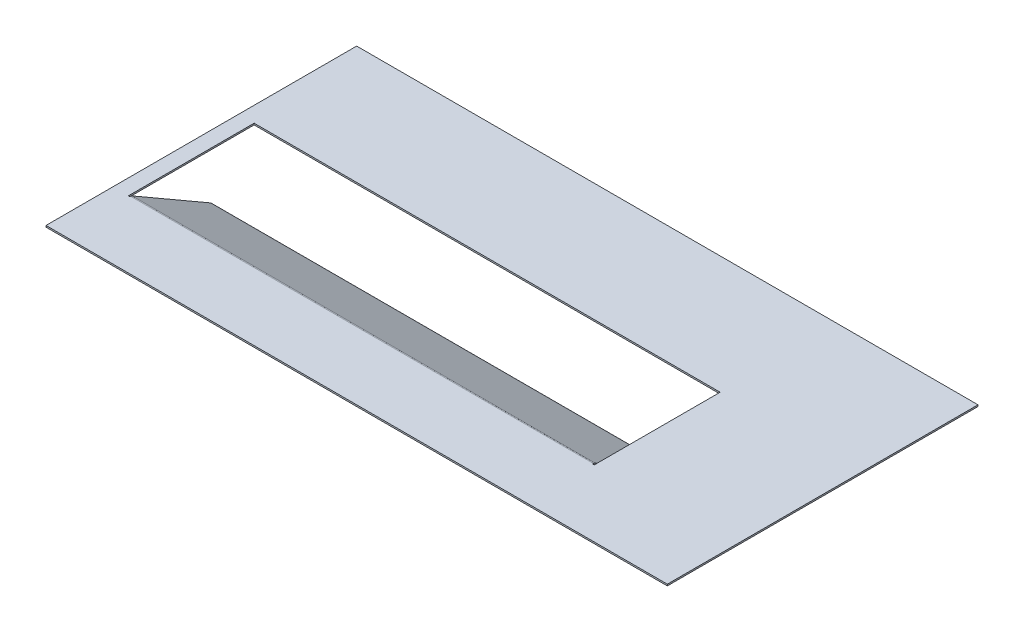
ISO-10303-21;
HEADER;
FILE_DESCRIPTION(('STEP AP214'),'2;1');
FILE_NAME('part.step','',(''),(''),'','','');
FILE_SCHEMA(('AUTOMOTIVE_DESIGN { 1 0 10303 214 1 1 1 1 }'));
ENDSEC;
DATA;
#1=APPLICATION_CONTEXT('core data for automotive mechanical design processes');
#2=APPLICATION_PROTOCOL_DEFINITION('international standard','automotive_design',2000,#1);
#3=PRODUCT_CONTEXT('',#1,'mechanical');
#4=PRODUCT('Part','Part','',(#3));
#5=PRODUCT_RELATED_PRODUCT_CATEGORY('part','',(#4));
#6=PRODUCT_DEFINITION_FORMATION('','',#4);
#7=PRODUCT_DEFINITION_CONTEXT('part definition',#1,'design');
#8=PRODUCT_DEFINITION('design','',#6,#7);
#9=PRODUCT_DEFINITION_SHAPE('','',#8);
#10=(LENGTH_UNIT() NAMED_UNIT(*) SI_UNIT(.MILLI.,.METRE.));
#11=(NAMED_UNIT(*) PLANE_ANGLE_UNIT() SI_UNIT($,.RADIAN.));
#12=(NAMED_UNIT(*) SI_UNIT($,.STERADIAN.) SOLID_ANGLE_UNIT());
#13=UNCERTAINTY_MEASURE_WITH_UNIT(LENGTH_MEASURE(1.E-05),#10,'distance_accuracy_value','');
#14=(GEOMETRIC_REPRESENTATION_CONTEXT(3) GLOBAL_UNCERTAINTY_ASSIGNED_CONTEXT((#13)) GLOBAL_UNIT_ASSIGNED_CONTEXT((#10,
#11,#12)) REPRESENTATION_CONTEXT('',''));
#15=CARTESIAN_POINT('',(0.,0.,0.));
#16=DIRECTION('',(0.,0.,1.));
#17=DIRECTION('',(1.,0.,0.));
#18=AXIS2_PLACEMENT_3D('',#15,#16,#17);
#19=CARTESIAN_POINT('',(-1000.,0.,0.));
#20=DIRECTION('',(0.,0.,-1.));
#21=DIRECTION('',(-1.,0.,0.));
#22=AXIS2_PLACEMENT_3D('',#19,#20,#21);
#23=PLANE('',#22);
#24=DIRECTION('',(1.,0.,0.));
#25=VECTOR('',#24,1.);
#26=CARTESIAN_POINT('',(0.,2.5,0.));
#27=LINE('',#26,#25);
#28=CARTESIAN_POINT('',(-1000.,2.5,0.));
#29=VERTEX_POINT('',#28);
#30=CARTESIAN_POINT('',(0.,2.5,0.));
#31=VERTEX_POINT('',#30);
#32=EDGE_CURVE('E293',#29,#31,#27,.T.);
#33=ORIENTED_EDGE('',*,*,#32,.T.);
#34=DIRECTION('',(0.,1.,0.));
#35=VECTOR('',#34,1.);
#36=CARTESIAN_POINT('',(0.,0.,0.));
#37=LINE('',#36,#35);
#38=CARTESIAN_POINT('',(0.,0.,0.));
#39=VERTEX_POINT('',#38);
#40=EDGE_CURVE('E238',#39,#31,#37,.T.);
#41=ORIENTED_EDGE('',*,*,#40,.F.);
#42=DIRECTION('',(-1.,0.,0.));
#43=VECTOR('',#42,1.);
#44=CARTESIAN_POINT('',(0.,0.,0.));
#45=LINE('',#44,#43);
#46=CARTESIAN_POINT('',(-1000.,0.,0.));
#47=VERTEX_POINT('',#46);
#48=EDGE_CURVE('E368',#39,#47,#45,.T.);
#49=ORIENTED_EDGE('',*,*,#48,.T.);
#50=DIRECTION('',(0.,1.,0.));
#51=VECTOR('',#50,1.);
#52=CARTESIAN_POINT('',(-1000.,0.,0.));
#53=LINE('',#52,#51);
#54=EDGE_CURVE('E11',#47,#29,#53,.T.);
#55=ORIENTED_EDGE('',*,*,#54,.T.);
#56=EDGE_LOOP('',(#33,#41,#49,#55));
#57=FACE_BOUND('',#56,.T.);
#58=ADVANCED_FACE('F17',(#57),#23,.T.);
#59=CARTESIAN_POINT('',(-1000.,0.,500.));
#60=DIRECTION('',(-1.,0.,0.));
#61=DIRECTION('',(0.,0.,1.));
#62=AXIS2_PLACEMENT_3D('',#59,#60,#61);
#63=PLANE('',#62);
#64=DIRECTION('',(0.,0.,-1.));
#65=VECTOR('',#64,1.);
#66=CARTESIAN_POINT('',(-1000.,2.5,0.));
#67=LINE('',#66,#65);
#68=CARTESIAN_POINT('',(-1000.,2.5,500.));
#69=VERTEX_POINT('',#68);
#70=EDGE_CURVE('E289',#69,#29,#67,.T.);
#71=ORIENTED_EDGE('',*,*,#70,.T.);
#72=ORIENTED_EDGE('',*,*,#54,.F.);
#73=DIRECTION('',(0.,0.,1.));
#74=VECTOR('',#73,1.);
#75=CARTESIAN_POINT('',(-1000.,0.,0.));
#76=LINE('',#75,#74);
#77=CARTESIAN_POINT('',(-1000.,0.,500.));
#78=VERTEX_POINT('',#77);
#79=EDGE_CURVE('E241',#47,#78,#76,.T.);
#80=ORIENTED_EDGE('',*,*,#79,.T.);
#81=DIRECTION('',(0.,1.,0.));
#82=VECTOR('',#81,1.);
#83=CARTESIAN_POINT('',(-1000.,0.,500.));
#84=LINE('',#83,#82);
#85=EDGE_CURVE('E28',#78,#69,#84,.T.);
#86=ORIENTED_EDGE('',*,*,#85,.T.);
#87=EDGE_LOOP('',(#71,#72,#80,#86));
#88=FACE_BOUND('',#87,.T.);
#89=ADVANCED_FACE('F688',(#88),#63,.T.);
#90=CARTESIAN_POINT('',(1.71574348007947E-13,0.,500.));
#91=DIRECTION('',(0.,0.,1.));
#92=DIRECTION('',(1.,0.,0.));
#93=AXIS2_PLACEMENT_3D('',#90,#91,#92);
#94=PLANE('',#93);
#95=DIRECTION('',(-1.,0.,0.));
#96=VECTOR('',#95,1.);
#97=CARTESIAN_POINT('',(-1000.,2.5,500.));
#98=LINE('',#97,#96);
#99=CARTESIAN_POINT('',(1.71574348007947E-13,2.5,500.));
#100=VERTEX_POINT('',#99);
#101=EDGE_CURVE('E292',#100,#69,#98,.T.);
#102=ORIENTED_EDGE('',*,*,#101,.T.);
#103=ORIENTED_EDGE('',*,*,#85,.F.);
#104=DIRECTION('',(1.,0.,0.));
#105=VECTOR('',#104,1.);
#106=CARTESIAN_POINT('',(-1000.,0.,500.));
#107=LINE('',#106,#105);
#108=CARTESIAN_POINT('',(1.71574348007947E-13,0.,500.));
#109=VERTEX_POINT('',#108);
#110=EDGE_CURVE('E246',#78,#109,#107,.T.);
#111=ORIENTED_EDGE('',*,*,#110,.T.);
#112=DIRECTION('',(0.,1.,0.));
#113=VECTOR('',#112,1.);
#114=CARTESIAN_POINT('',(1.71574348007947E-13,0.,500.));
#115=LINE('',#114,#113);
#116=EDGE_CURVE('E236',#109,#100,#115,.T.);
#117=ORIENTED_EDGE('',*,*,#116,.T.);
#118=EDGE_LOOP('',(#102,#103,#111,#117));
#119=FACE_BOUND('',#118,.T.);
#120=ADVANCED_FACE('F690',(#119),#94,.T.);
#121=CARTESIAN_POINT('',(0.,0.,0.));
#122=DIRECTION('',(1.,0.,0.));
#123=DIRECTION('',(0.,0.,-1.));
#124=AXIS2_PLACEMENT_3D('',#121,#122,#123);
#125=PLANE('',#124);
#126=DIRECTION('',(0.,0.,1.));
#127=VECTOR('',#126,1.);
#128=CARTESIAN_POINT('',(1.71574348007947E-13,2.5,500.));
#129=LINE('',#128,#127);
#130=EDGE_CURVE('E212',#31,#100,#129,.T.);
#131=ORIENTED_EDGE('',*,*,#130,.T.);
#132=ORIENTED_EDGE('',*,*,#116,.F.);
#133=DIRECTION('',(0.,0.,-1.));
#134=VECTOR('',#133,1.);
#135=CARTESIAN_POINT('',(1.71574348007947E-13,0.,500.));
#136=LINE('',#135,#134);
#137=EDGE_CURVE('E372',#109,#39,#136,.T.);
#138=ORIENTED_EDGE('',*,*,#137,.T.);
#139=ORIENTED_EDGE('',*,*,#40,.T.);
#140=EDGE_LOOP('',(#131,#132,#138,#139));
#141=FACE_BOUND('',#140,.T.);
#142=ADVANCED_FACE('F683',(#141),#125,.T.);
#143=CARTESIAN_POINT('',(-975.,2.5,390.));
#144=DIRECTION('',(-1.,0.,0.));
#145=DIRECTION('',(0.,0.,1.));
#146=AXIS2_PLACEMENT_3D('',#143,#144,#145);
#147=PLANE('',#146);
#148=DIRECTION('',(0.,0.,1.));
#149=VECTOR('',#148,1.);
#150=CARTESIAN_POINT('',(-975.,0.,320.));
#151=LINE('',#150,#149);
#152=CARTESIAN_POINT('',(-975.,0.,190.));
#153=VERTEX_POINT('',#152);
#154=CARTESIAN_POINT('',(-975.,0.,392.589745962156));
#155=VERTEX_POINT('',#154);
#156=EDGE_CURVE('E355',#153,#155,#151,.T.);
#157=ORIENTED_EDGE('',*,*,#156,.F.);
#158=DIRECTION('',(0.,-1.,0.));
#159=VECTOR('',#158,1.);
#160=CARTESIAN_POINT('',(-975.,2.5,190.));
#161=LINE('',#160,#159);
#162=CARTESIAN_POINT('',(-975.,2.5,190.));
#163=VERTEX_POINT('',#162);
#164=EDGE_CURVE('E42',#163,#153,#161,.T.);
#165=ORIENTED_EDGE('',*,*,#164,.F.);
#166=DIRECTION('',(0.,0.,-1.));
#167=VECTOR('',#166,1.);
#168=CARTESIAN_POINT('',(-975.,2.5,320.));
#169=LINE('',#168,#167);
#170=CARTESIAN_POINT('',(-975.,2.5,392.589745962156));
#171=VERTEX_POINT('',#170);
#172=EDGE_CURVE('E322',#171,#163,#169,.T.);
#173=ORIENTED_EDGE('',*,*,#172,.F.);
#174=DIRECTION('',(0.,1.,0.));
#175=VECTOR('',#174,1.);
#176=CARTESIAN_POINT('',(-975.,0.,392.589745962156));
#177=LINE('',#176,#175);
#178=EDGE_CURVE('E373',#155,#171,#177,.T.);
#179=ORIENTED_EDGE('',*,*,#178,.F.);
#180=EDGE_LOOP('',(#157,#165,#173,#179));
#181=FACE_BOUND('',#180,.T.);
#182=ADVANCED_FACE('F657',(#181),#147,.F.);
#183=CARTESIAN_POINT('',(-429.951279615458,2.5,190.));
#184=DIRECTION('',(0.,0.,-1.));
#185=DIRECTION('',(0.,-1.,0.));
#186=AXIS2_PLACEMENT_3D('',#183,#184,#185);
#187=PLANE('',#186);
#188=DIRECTION('',(-1.,0.,0.));
#189=VECTOR('',#188,1.);
#190=CARTESIAN_POINT('',(-464.975639807729,0.,190.));
#191=LINE('',#190,#189);
#192=CARTESIAN_POINT('',(-225.,0.,190.));
#193=VERTEX_POINT('',#192);
#194=EDGE_CURVE('E351',#193,#153,#191,.T.);
#195=ORIENTED_EDGE('',*,*,#194,.F.);
#196=DIRECTION('',(0.,-1.,0.));
#197=VECTOR('',#196,1.);
#198=CARTESIAN_POINT('',(-225.,2.5,190.));
#199=LINE('',#198,#197);
#200=CARTESIAN_POINT('',(-225.,2.5,190.));
#201=VERTEX_POINT('',#200);
#202=EDGE_CURVE('E391',#201,#193,#199,.T.);
#203=ORIENTED_EDGE('',*,*,#202,.F.);
#204=DIRECTION('',(1.,0.,0.));
#205=VECTOR('',#204,1.);
#206=CARTESIAN_POINT('',(-464.975639807729,2.5,190.));
#207=LINE('',#206,#205);
#208=EDGE_CURVE('E21',#163,#201,#207,.T.);
#209=ORIENTED_EDGE('',*,*,#208,.F.);
#210=ORIENTED_EDGE('',*,*,#164,.T.);
#211=EDGE_LOOP('',(#195,#203,#209,#210));
#212=FACE_BOUND('',#211,.T.);
#213=ADVANCED_FACE('F651',(#212),#187,.F.);
#214=CARTESIAN_POINT('',(-225.,2.5,190.));
#215=DIRECTION('',(1.,0.,0.));
#216=DIRECTION('',(0.,0.,-1.));
#217=AXIS2_PLACEMENT_3D('',#214,#215,#216);
#218=PLANE('',#217);
#219=DIRECTION('',(0.,0.,-1.));
#220=VECTOR('',#219,1.);
#221=CARTESIAN_POINT('',(-225.,0.,320.));
#222=LINE('',#221,#220);
#223=CARTESIAN_POINT('',(-225.,0.,392.589745962156));
#224=VERTEX_POINT('',#223);
#225=EDGE_CURVE('E245',#224,#193,#222,.T.);
#226=ORIENTED_EDGE('',*,*,#225,.F.);
#227=DIRECTION('',(0.,1.,0.));
#228=VECTOR('',#227,1.);
#229=CARTESIAN_POINT('',(-225.,0.,392.589745962156));
#230=LINE('',#229,#228);
#231=CARTESIAN_POINT('',(-225.,2.5,392.589745962156));
#232=VERTEX_POINT('',#231);
#233=EDGE_CURVE('E208',#224,#232,#230,.T.);
#234=ORIENTED_EDGE('',*,*,#233,.T.);
#235=DIRECTION('',(0.,0.,1.));
#236=VECTOR('',#235,1.);
#237=CARTESIAN_POINT('',(-225.,2.5,320.));
#238=LINE('',#237,#236);
#239=EDGE_CURVE('E303',#201,#232,#238,.T.);
#240=ORIENTED_EDGE('',*,*,#239,.F.);
#241=ORIENTED_EDGE('',*,*,#202,.T.);
#242=EDGE_LOOP('',(#226,#234,#240,#241));
#243=FACE_BOUND('',#242,.T.);
#244=ADVANCED_FACE('F649',(#243),#218,.F.);
#245=CARTESIAN_POINT('',(-500.,0.,250.));
#246=DIRECTION('',(0.,1.,0.));
#247=DIRECTION('',(1.,0.,0.));
#248=AXIS2_PLACEMENT_3D('',#245,#246,#247);
#249=PLANE('',#248);
#250=ORIENTED_EDGE('',*,*,#225,.T.);
#251=ORIENTED_EDGE('',*,*,#194,.T.);
#252=ORIENTED_EDGE('',*,*,#156,.T.);
#253=DIRECTION('',(1.,0.,0.));
#254=VECTOR('',#253,1.);
#255=CARTESIAN_POINT('',(-736.25,0.,392.589745962156));
#256=LINE('',#255,#254);
#257=CARTESIAN_POINT('',(-972.5,0.,392.589745962156));
#258=VERTEX_POINT('',#257);
#259=EDGE_CURVE('E397',#155,#258,#256,.T.);
#260=ORIENTED_EDGE('',*,*,#259,.T.);
#261=DIRECTION('',(0.,0.,-1.));
#262=VECTOR('',#261,1.);
#263=CARTESIAN_POINT('',(-972.5,0.,320.));
#264=LINE('',#263,#262);
#265=CARTESIAN_POINT('',(-972.5,0.,391.339745962156));
#266=VERTEX_POINT('',#265);
#267=EDGE_CURVE('E333',#258,#266,#264,.T.);
#268=ORIENTED_EDGE('',*,*,#267,.T.);
#269=DIRECTION('',(1.,0.,0.));
#270=VECTOR('',#269,1.);
#271=CARTESIAN_POINT('',(-363.75,0.,391.339745962156));
#272=LINE('',#271,#270);
#273=CARTESIAN_POINT('',(-227.5,0.,391.339745962156));
#274=VERTEX_POINT('',#273);
#275=EDGE_CURVE('E219',#266,#274,#272,.T.);
#276=ORIENTED_EDGE('',*,*,#275,.T.);
#277=DIRECTION('',(0.,0.,1.));
#278=VECTOR('',#277,1.);
#279=CARTESIAN_POINT('',(-227.5,0.,321.294872981078));
#280=LINE('',#279,#278);
#281=CARTESIAN_POINT('',(-227.5,0.,392.589745962156));
#282=VERTEX_POINT('',#281);
#283=EDGE_CURVE('E215',#274,#282,#280,.T.);
#284=ORIENTED_EDGE('',*,*,#283,.T.);
#285=DIRECTION('',(1.,0.,0.));
#286=VECTOR('',#285,1.);
#287=CARTESIAN_POINT('',(-362.5,0.,392.589745962156));
#288=LINE('',#287,#286);
#289=EDGE_CURVE('E201',#282,#224,#288,.T.);
#290=ORIENTED_EDGE('',*,*,#289,.T.);
#291=EDGE_LOOP('',(#250,#251,#252,#260,#268,#276,#284,#290));
#292=FACE_BOUND('',#291,.T.);
#293=ORIENTED_EDGE('',*,*,#48,.F.);
#294=ORIENTED_EDGE('',*,*,#137,.F.);
#295=ORIENTED_EDGE('',*,*,#110,.F.);
#296=ORIENTED_EDGE('',*,*,#79,.F.);
#297=EDGE_LOOP('',(#293,#294,#295,#296));
#298=FACE_BOUND('',#297,.T.);
#299=ADVANCED_FACE('F216',(#292,#298),#249,.F.);
#300=CARTESIAN_POINT('',(-972.5,0.,392.589745962156));
#301=DIRECTION('',(0.,0.,1.));
#302=DIRECTION('',(1.,0.,0.));
#303=AXIS2_PLACEMENT_3D('',#300,#301,#302);
#304=PLANE('',#303);
#305=DIRECTION('',(-1.,0.,0.));
#306=VECTOR('',#305,1.);
#307=CARTESIAN_POINT('',(-736.25,2.5,392.589745962156));
#308=LINE('',#307,#306);
#309=CARTESIAN_POINT('',(-972.5,2.5,392.589745962156));
#310=VERTEX_POINT('',#309);
#311=EDGE_CURVE('E318',#310,#171,#308,.T.);
#312=ORIENTED_EDGE('',*,*,#311,.F.);
#313=DIRECTION('',(0.,1.,0.));
#314=VECTOR('',#313,1.);
#315=CARTESIAN_POINT('',(-972.5,0.,392.589745962156));
#316=LINE('',#315,#314);
#317=EDGE_CURVE('E335',#258,#310,#316,.T.);
#318=ORIENTED_EDGE('',*,*,#317,.F.);
#319=ORIENTED_EDGE('',*,*,#259,.F.);
#320=ORIENTED_EDGE('',*,*,#178,.T.);
#321=EDGE_LOOP('',(#312,#318,#319,#320));
#322=FACE_BOUND('',#321,.T.);
#323=ADVANCED_FACE('F660',(#322),#304,.F.);
#324=CARTESIAN_POINT('',(-972.5,0.,390.));
#325=DIRECTION('',(1.,0.,0.));
#326=DIRECTION('',(0.,1.,0.));
#327=AXIS2_PLACEMENT_3D('',#324,#325,#326);
#328=PLANE('',#327);
#329=DIRECTION('',(0.,1.,0.));
#330=VECTOR('',#329,1.);
#331=CARTESIAN_POINT('',(-972.5,0.,391.339745962156));
#332=LINE('',#331,#330);
#333=CARTESIAN_POINT('',(-972.5,2.5,391.339745962156));
#334=VERTEX_POINT('',#333);
#335=EDGE_CURVE('E274',#266,#334,#332,.T.);
#336=ORIENTED_EDGE('',*,*,#335,.F.);
#337=ORIENTED_EDGE('',*,*,#267,.F.);
#338=ORIENTED_EDGE('',*,*,#317,.T.);
#339=DIRECTION('',(0.,0.,1.));
#340=VECTOR('',#339,1.);
#341=CARTESIAN_POINT('',(-972.5,2.5,320.));
#342=LINE('',#341,#340);
#343=EDGE_CURVE('E323',#334,#310,#342,.T.);
#344=ORIENTED_EDGE('',*,*,#343,.F.);
#345=EDGE_LOOP('',(#336,#337,#338,#344));
#346=FACE_BOUND('',#345,.T.);
#347=ADVANCED_FACE('F664',(#346),#328,.F.);
#348=CARTESIAN_POINT('',(-500.,2.5,250.));
#349=DIRECTION('',(0.,1.,0.));
#350=DIRECTION('',(1.,0.,0.));
#351=AXIS2_PLACEMENT_3D('',#348,#349,#350);
#352=PLANE('',#351);
#353=ORIENTED_EDGE('',*,*,#239,.T.);
#354=DIRECTION('',(-1.,0.,0.));
#355=VECTOR('',#354,1.);
#356=CARTESIAN_POINT('',(-362.5,2.5,392.589745962156));
#357=LINE('',#356,#355);
#358=CARTESIAN_POINT('',(-227.5,2.5,392.589745962156));
#359=VERTEX_POINT('',#358);
#360=EDGE_CURVE('E193',#232,#359,#357,.T.);
#361=ORIENTED_EDGE('',*,*,#360,.T.);
#362=DIRECTION('',(0.,0.,-1.));
#363=VECTOR('',#362,1.);
#364=CARTESIAN_POINT('',(-227.5,2.5,321.294872981078));
#365=LINE('',#364,#363);
#366=CARTESIAN_POINT('',(-227.5,2.5,391.339745962156));
#367=VERTEX_POINT('',#366);
#368=EDGE_CURVE('E226',#359,#367,#365,.T.);
#369=ORIENTED_EDGE('',*,*,#368,.T.);
#370=DIRECTION('',(-1.,0.,0.));
#371=VECTOR('',#370,1.);
#372=CARTESIAN_POINT('',(-363.75,2.5,391.339745962156));
#373=LINE('',#372,#371);
#374=EDGE_CURVE('E252',#367,#334,#373,.T.);
#375=ORIENTED_EDGE('',*,*,#374,.T.);
#376=ORIENTED_EDGE('',*,*,#343,.T.);
#377=ORIENTED_EDGE('',*,*,#311,.T.);
#378=ORIENTED_EDGE('',*,*,#172,.T.);
#379=ORIENTED_EDGE('',*,*,#208,.T.);
#380=EDGE_LOOP('',(#353,#361,#369,#375,#376,#377,#378,#379));
#381=FACE_BOUND('',#380,.T.);
#382=ORIENTED_EDGE('',*,*,#130,.F.);
#383=ORIENTED_EDGE('',*,*,#32,.F.);
#384=ORIENTED_EDGE('',*,*,#70,.F.);
#385=ORIENTED_EDGE('',*,*,#101,.F.);
#386=EDGE_LOOP('',(#382,#383,#384,#385));
#387=FACE_BOUND('',#386,.T.);
#388=ADVANCED_FACE('F677',(#381,#387),#352,.T.);
#389=CARTESIAN_POINT('',(-225.,0.,392.589745962156));
#390=DIRECTION('',(0.,0.,1.));
#391=DIRECTION('',(1.,0.,0.));
#392=AXIS2_PLACEMENT_3D('',#389,#390,#391);
#393=PLANE('',#392);
#394=ORIENTED_EDGE('',*,*,#360,.F.);
#395=ORIENTED_EDGE('',*,*,#233,.F.);
#396=ORIENTED_EDGE('',*,*,#289,.F.);
#397=DIRECTION('',(0.,1.,0.));
#398=VECTOR('',#397,1.);
#399=CARTESIAN_POINT('',(-227.5,0.,392.589745962156));
#400=LINE('',#399,#398);
#401=EDGE_CURVE('E205',#282,#359,#400,.T.);
#402=ORIENTED_EDGE('',*,*,#401,.T.);
#403=EDGE_LOOP('',(#394,#395,#396,#402));
#404=FACE_BOUND('',#403,.T.);
#405=ADVANCED_FACE('F203',(#404),#393,.F.);
#406=CARTESIAN_POINT('',(-227.5,0.,392.589745962156));
#407=DIRECTION('',(-1.,0.,0.));
#408=DIRECTION('',(0.,0.,1.));
#409=AXIS2_PLACEMENT_3D('',#406,#407,#408);
#410=PLANE('',#409);
#411=DIRECTION('',(0.,1.,0.));
#412=VECTOR('',#411,1.);
#413=CARTESIAN_POINT('',(-227.5,0.,391.339745962156));
#414=LINE('',#413,#412);
#415=EDGE_CURVE('E283',#274,#367,#414,.T.);
#416=ORIENTED_EDGE('',*,*,#415,.T.);
#417=ORIENTED_EDGE('',*,*,#368,.F.);
#418=ORIENTED_EDGE('',*,*,#401,.F.);
#419=ORIENTED_EDGE('',*,*,#283,.F.);
#420=EDGE_LOOP('',(#416,#417,#418,#419));
#421=FACE_BOUND('',#420,.T.);
#422=ADVANCED_FACE('F225',(#421),#410,.F.);
#423=CARTESIAN_POINT('',(-600.,-2.49999999999983,391.339745962156));
#424=DIRECTION('',(-1.,0.,0.));
#425=DIRECTION('',(0.,1.,0.));
#426=AXIS2_PLACEMENT_3D('',#423,#424,#425);
#427=CYLINDRICAL_SURFACE('',#426,2.49999999999991);
#428=DIRECTION('',(-1.,0.,0.));
#429=VECTOR('',#428,1.);
#430=CARTESIAN_POINT('',(-600.,-0.334936490538738,390.089745962156));
#431=LINE('',#430,#429);
#432=CARTESIAN_POINT('',(-227.5,-0.33493649053856,390.089745962155));
#433=VERTEX_POINT('',#432);
#434=CARTESIAN_POINT('',(-972.5,-0.33493649053888,390.089745962156));
#435=VERTEX_POINT('',#434);
#436=EDGE_CURVE('E258',#433,#435,#431,.T.);
#437=ORIENTED_EDGE('',*,*,#436,.F.);
#438=CARTESIAN_POINT('',(-227.5,-2.49999999999983,391.339745962156));
#439=DIRECTION('',(1.,0.,0.));
#440=DIRECTION('',(0.,0.866025403784441,-0.5));
#441=AXIS2_PLACEMENT_3D('',#438,#439,#440);
#442=CIRCLE('',#441,2.50000000000016);
#443=EDGE_CURVE('E326',#433,#274,#442,.T.);
#444=ORIENTED_EDGE('',*,*,#443,.T.);
#445=ORIENTED_EDGE('',*,*,#275,.F.);
#446=CARTESIAN_POINT('',(-972.5,-2.49999999999983,391.339745962156));
#447=DIRECTION('',(1.,0.,0.));
#448=DIRECTION('',(0.,0.866025403784445,-0.49999999999999));
#449=AXIS2_PLACEMENT_3D('',#446,#447,#448);
#450=CIRCLE('',#449,2.49999999999977);
#451=EDGE_CURVE('E251',#435,#266,#450,.T.);
#452=ORIENTED_EDGE('',*,*,#451,.F.);
#453=EDGE_LOOP('',(#437,#444,#445,#452));
#454=FACE_BOUND('',#453,.T.);
#455=ADVANCED_FACE('F667',(#454),#427,.F.);
#456=CARTESIAN_POINT('',(-600.,-34.8636975924995,325.28417741115));
#457=DIRECTION('',(0.,0.866025403784444,-0.49999999999999));
#458=DIRECTION('',(-1.,0.,0.));
#459=AXIS2_PLACEMENT_3D('',#456,#457,#458);
#460=PLANE('',#459);
#461=DIRECTION('',(-1.,0.,0.));
#462=VECTOR('',#461,1.);
#463=CARTESIAN_POINT('',(-413.75,-71.0566243270242,262.596189432334));
#464=LINE('',#463,#462);
#465=CARTESIAN_POINT('',(-227.5,-71.0566243270241,262.596189432333));
#466=VERTEX_POINT('',#465);
#467=CARTESIAN_POINT('',(-972.5,-71.0566243270243,262.596189432334));
#468=VERTEX_POINT('',#467);
#469=EDGE_CURVE('E259',#466,#468,#464,.T.);
#470=ORIENTED_EDGE('',*,*,#469,.T.);
#471=DIRECTION('',(0.,-0.49999999999999,-0.866025403784444));
#472=VECTOR('',#471,1.);
#473=CARTESIAN_POINT('',(-972.5,1.83012701892238,388.839745962156));
#474=LINE('',#473,#472);
#475=CARTESIAN_POINT('',(-972.5,1.83012701892221,388.839745962156));
#476=VERTEX_POINT('',#475);
#477=EDGE_CURVE('E315',#476,#468,#474,.T.);
#478=ORIENTED_EDGE('',*,*,#477,.F.);
#479=DIRECTION('',(1.,0.,0.));
#480=VECTOR('',#479,1.);
#481=CARTESIAN_POINT('',(-600.,1.83012701892235,388.839745962156));
#482=LINE('',#481,#480);
#483=CARTESIAN_POINT('',(-227.5,1.83012701892256,388.839745962155));
#484=VERTEX_POINT('',#483);
#485=EDGE_CURVE('E388',#476,#484,#482,.T.);
#486=ORIENTED_EDGE('',*,*,#485,.T.);
#487=DIRECTION('',(0.,0.499999999999941,0.866025403784473));
#488=VECTOR('',#487,1.);
#489=CARTESIAN_POINT('',(-227.5,7.48499379538355,398.634262529021));
#490=LINE('',#489,#488);
#491=EDGE_CURVE('E253',#466,#484,#490,.T.);
#492=ORIENTED_EDGE('',*,*,#491,.F.);
#493=EDGE_LOOP('',(#470,#478,#486,#492));
#494=FACE_BOUND('',#493,.T.);
#495=ADVANCED_FACE('F832',(#494),#460,.T.);
#496=CARTESIAN_POINT('',(-227.5,1.83012701892254,388.839745962156));
#497=DIRECTION('',(1.,0.,0.));
#498=DIRECTION('',(0.,0.,-1.));
#499=AXIS2_PLACEMENT_3D('',#496,#497,#498);
#500=PLANE('',#499);
#501=DIRECTION('',(0.,-0.866025403784444,0.49999999999999));
#502=VECTOR('',#501,1.);
#503=CARTESIAN_POINT('',(-227.5,0.141377481542797,389.814745962155));
#504=LINE('',#503,#502);
#505=EDGE_CURVE('E257',#484,#433,#504,.T.);
#506=ORIENTED_EDGE('',*,*,#505,.F.);
#507=CARTESIAN_POINT('',(-227.5,-2.49999999999983,391.339745962156));
#508=DIRECTION('',(1.,0.,0.));
#509=DIRECTION('',(0.,0.866025403784447,-0.499999999999985));
#510=AXIS2_PLACEMENT_3D('',#507,#508,#509);
#511=CIRCLE('',#510,5.00000000000015);
#512=EDGE_CURVE('E247',#484,#367,#511,.T.);
#513=ORIENTED_EDGE('',*,*,#512,.T.);
#514=ORIENTED_EDGE('',*,*,#415,.F.);
#515=ORIENTED_EDGE('',*,*,#443,.F.);
#516=EDGE_LOOP('',(#506,#513,#514,#515));
#517=FACE_BOUND('',#516,.T.);
#518=ADVANCED_FACE('F671',(#517),#500,.T.);
#519=CARTESIAN_POINT('',(-972.5,-0.334936490538916,390.089745962156));
#520=DIRECTION('',(-1.,0.,0.));
#521=DIRECTION('',(0.,1.,0.));
#522=AXIS2_PLACEMENT_3D('',#519,#520,#521);
#523=PLANE('',#522);
#524=DIRECTION('',(0.,0.866025403784444,-0.49999999999999));
#525=VECTOR('',#524,1.);
#526=CARTESIAN_POINT('',(-972.5,0.141377481542655,389.814745962156));
#527=LINE('',#526,#525);
#528=EDGE_CURVE('E430',#435,#476,#527,.T.);
#529=ORIENTED_EDGE('',*,*,#528,.F.);
#530=ORIENTED_EDGE('',*,*,#451,.T.);
#531=ORIENTED_EDGE('',*,*,#335,.T.);
#532=CARTESIAN_POINT('',(-972.5,-2.49999999999983,391.339745962156));
#533=DIRECTION('',(-1.,0.,0.));
#534=DIRECTION('',(0.,1.,0.));
#535=AXIS2_PLACEMENT_3D('',#532,#533,#534);
#536=CIRCLE('',#535,4.99999999999976);
#537=EDGE_CURVE('E385',#334,#476,#536,.T.);
#538=ORIENTED_EDGE('',*,*,#537,.T.);
#539=EDGE_LOOP('',(#529,#530,#531,#538));
#540=FACE_BOUND('',#539,.T.);
#541=ADVANCED_FACE('F726',(#540),#523,.T.);
#542=CARTESIAN_POINT('',(-600.,-2.49999999999983,391.339745962156));
#543=DIRECTION('',(-1.,0.,0.));
#544=DIRECTION('',(0.,1.,0.));
#545=AXIS2_PLACEMENT_3D('',#542,#543,#544);
#546=CYLINDRICAL_SURFACE('',#545,4.99999999999991);
#547=ORIENTED_EDGE('',*,*,#485,.F.);
#548=ORIENTED_EDGE('',*,*,#537,.F.);
#549=ORIENTED_EDGE('',*,*,#374,.F.);
#550=ORIENTED_EDGE('',*,*,#512,.F.);
#551=EDGE_LOOP('',(#547,#548,#549,#550));
#552=FACE_BOUND('',#551,.T.);
#553=ADVANCED_FACE('F676',(#552),#546,.T.);
#554=CARTESIAN_POINT('',(-227.5,-0.334936490538524,390.089745962156));
#555=DIRECTION('',(1.,0.,0.));
#556=DIRECTION('',(0.,0.,-1.));
#557=AXIS2_PLACEMENT_3D('',#554,#555,#556);
#558=PLANE('',#557);
#559=DIRECTION('',(0.,0.866025403784446,-0.499999999999987));
#560=VECTOR('',#559,1.);
#561=CARTESIAN_POINT('',(-227.5,-73.2216878364849,263.846189432333));
#562=LINE('',#561,#560);
#563=CARTESIAN_POINT('',(-227.5,-73.2216878364852,263.846189432333));
#564=VERTEX_POINT('',#563);
#565=EDGE_CURVE('E288',#564,#466,#562,.T.);
#566=ORIENTED_EDGE('',*,*,#565,.T.);
#567=ORIENTED_EDGE('',*,*,#491,.T.);
#568=ORIENTED_EDGE('',*,*,#505,.T.);
#569=DIRECTION('',(0.,0.499999999999941,0.866025403784473));
#570=VECTOR('',#569,1.);
#571=CARTESIAN_POINT('',(-227.5,5.31993028592243,399.884262529021));
#572=LINE('',#571,#570);
#573=EDGE_CURVE('E377',#564,#433,#572,.T.);
#574=ORIENTED_EDGE('',*,*,#573,.F.);
#575=EDGE_LOOP('',(#566,#567,#568,#574));
#576=FACE_BOUND('',#575,.T.);
#577=ADVANCED_FACE('F19',(#576),#558,.T.);
#578=CARTESIAN_POINT('',(-600.,-37.0287611019605,326.53417741115));
#579=DIRECTION('',(0.,0.866025403784444,-0.49999999999999));
#580=DIRECTION('',(-1.,0.,0.));
#581=AXIS2_PLACEMENT_3D('',#578,#579,#580);
#582=PLANE('',#581);
#583=DIRECTION('',(1.,0.,0.));
#584=VECTOR('',#583,1.);
#585=CARTESIAN_POINT('',(-413.75,-73.2216878364853,263.846189432334));
#586=LINE('',#585,#584);
#587=CARTESIAN_POINT('',(-972.5,-73.2216878364854,263.846189432334));
#588=VERTEX_POINT('',#587);
#589=EDGE_CURVE('E359',#588,#564,#586,.T.);
#590=ORIENTED_EDGE('',*,*,#589,.T.);
#591=ORIENTED_EDGE('',*,*,#573,.T.);
#592=ORIENTED_EDGE('',*,*,#436,.T.);
#593=DIRECTION('',(0.,0.500000000000007,0.866025403784435));
#594=VECTOR('',#593,1.);
#595=CARTESIAN_POINT('',(-972.5,5.31993028592296,399.884262529021));
#596=LINE('',#595,#594);
#597=EDGE_CURVE('E384',#588,#435,#596,.T.);
#598=ORIENTED_EDGE('',*,*,#597,.F.);
#599=EDGE_LOOP('',(#590,#591,#592,#598));
#600=FACE_BOUND('',#599,.T.);
#601=ADVANCED_FACE('F707',(#600),#582,.F.);
#602=CARTESIAN_POINT('',(-972.5,-0.334936490538738,390.089745962156));
#603=DIRECTION('',(-1.,0.,0.));
#604=DIRECTION('',(0.,1.,0.));
#605=AXIS2_PLACEMENT_3D('',#602,#603,#604);
#606=PLANE('',#605);
#607=DIRECTION('',(0.,-0.866025403784446,0.499999999999987));
#608=VECTOR('',#607,1.);
#609=CARTESIAN_POINT('',(-972.5,-73.221687836485,263.846189432334));
#610=LINE('',#609,#608);
#611=EDGE_CURVE('E340',#468,#588,#610,.T.);
#612=ORIENTED_EDGE('',*,*,#611,.T.);
#613=ORIENTED_EDGE('',*,*,#597,.T.);
#614=ORIENTED_EDGE('',*,*,#528,.T.);
#615=ORIENTED_EDGE('',*,*,#477,.T.);
#616=EDGE_LOOP('',(#612,#613,#614,#615));
#617=FACE_BOUND('',#616,.T.);
#618=ADVANCED_FACE('F477',(#617),#606,.T.);
#619=CARTESIAN_POINT('',(-600.,-75.3867513459463,265.096189432334));
#620=DIRECTION('',(-1.,0.,0.));
#621=DIRECTION('',(0.,0.866025403784444,-0.499999999999991));
#622=AXIS2_PLACEMENT_3D('',#619,#620,#621);
#623=CYLINDRICAL_SURFACE('',#622,2.49999999999986);
#624=DIRECTION('',(-1.,0.,0.));
#625=VECTOR('',#624,1.);
#626=CARTESIAN_POINT('',(-600.,-75.3867513459463,262.596189432334));
#627=LINE('',#626,#625);
#628=CARTESIAN_POINT('',(-227.5,-75.3867513459462,262.596189432333));
#629=VERTEX_POINT('',#628);
#630=CARTESIAN_POINT('',(-972.5,-75.3867513459463,262.596189432334));
#631=VERTEX_POINT('',#630);
#632=EDGE_CURVE('E270',#629,#631,#627,.T.);
#633=ORIENTED_EDGE('',*,*,#632,.F.);
#634=CARTESIAN_POINT('',(-227.5,-75.3867513459462,265.096189432333));
#635=DIRECTION('',(1.,0.,0.));
#636=DIRECTION('',(0.,0.,-1.));
#637=AXIS2_PLACEMENT_3D('',#634,#635,#636);
#638=CIRCLE('',#637,2.49999999999989);
#639=EDGE_CURVE('E284',#629,#564,#638,.T.);
#640=ORIENTED_EDGE('',*,*,#639,.T.);
#641=ORIENTED_EDGE('',*,*,#589,.F.);
#642=CARTESIAN_POINT('',(-972.5,-75.3867513459464,265.096189432334));
#643=DIRECTION('',(1.,0.,0.));
#644=DIRECTION('',(0.,0.,-1.));
#645=AXIS2_PLACEMENT_3D('',#642,#643,#644);
#646=CIRCLE('',#645,2.49999999999989);
#647=EDGE_CURVE('E279',#631,#588,#646,.T.);
#648=ORIENTED_EDGE('',*,*,#647,.F.);
#649=EDGE_LOOP('',(#633,#640,#641,#648));
#650=FACE_BOUND('',#649,.T.);
#651=ADVANCED_FACE('F472',(#650),#623,.F.);
#652=CARTESIAN_POINT('',(-600.,-84.5584200808182,260.096189432334));
#653=DIRECTION('',(0.,0.,-1.));
#654=DIRECTION('',(-1.,0.,0.));
#655=AXIS2_PLACEMENT_3D('',#652,#653,#654);
#656=PLANE('',#655);
#657=DIRECTION('',(1.,0.,0.));
#658=VECTOR('',#657,1.);
#659=CARTESIAN_POINT('',(-600.,-75.3867513459462,260.096189432334));
#660=LINE('',#659,#658);
#661=CARTESIAN_POINT('',(-972.5,-75.3867513459463,260.096189432334));
#662=VERTEX_POINT('',#661);
#663=CARTESIAN_POINT('',(-227.5,-75.3867513459461,260.096189432334));
#664=VERTEX_POINT('',#663);
#665=EDGE_CURVE('E329',#662,#664,#660,.T.);
#666=ORIENTED_EDGE('',*,*,#665,.T.);
#667=DIRECTION('',(0.,1.,0.));
#668=VECTOR('',#667,1.);
#669=CARTESIAN_POINT('',(-227.5,-64.0770177930229,260.096189432334));
#670=LINE('',#669,#668);
#671=CARTESIAN_POINT('',(-227.5,-97.499999999998,260.096189432333));
#672=VERTEX_POINT('',#671);
#673=EDGE_CURVE('E344',#672,#664,#670,.T.);
#674=ORIENTED_EDGE('',*,*,#673,.F.);
#675=DIRECTION('',(1.,0.,0.));
#676=VECTOR('',#675,1.);
#677=CARTESIAN_POINT('',(-972.5,-97.4999999999982,260.096189432334));
#678=LINE('',#677,#676);
#679=CARTESIAN_POINT('',(-972.5,-97.4999999999982,260.096189432334));
#680=VERTEX_POINT('',#679);
#681=EDGE_CURVE('E356',#680,#672,#678,.T.);
#682=ORIENTED_EDGE('',*,*,#681,.F.);
#683=DIRECTION('',(0.,-1.,0.));
#684=VECTOR('',#683,1.);
#685=CARTESIAN_POINT('',(-972.5,-75.3867513459463,260.096189432334));
#686=LINE('',#685,#684);
#687=EDGE_CURVE('E287',#662,#680,#686,.T.);
#688=ORIENTED_EDGE('',*,*,#687,.F.);
#689=EDGE_LOOP('',(#666,#674,#682,#688));
#690=FACE_BOUND('',#689,.T.);
#691=ADVANCED_FACE('F462',(#690),#656,.T.);
#692=CARTESIAN_POINT('',(-972.5,-97.4999999999983,262.596189432334));
#693=DIRECTION('',(0.,-1.,0.));
#694=DIRECTION('',(0.,0.,-1.));
#695=AXIS2_PLACEMENT_3D('',#692,#693,#694);
#696=PLANE('',#695);
#697=ORIENTED_EDGE('',*,*,#681,.T.);
#698=DIRECTION('',(0.,0.,-1.));
#699=VECTOR('',#698,1.);
#700=CARTESIAN_POINT('',(-227.5,-97.499999999998,262.596189432333));
#701=LINE('',#700,#699);
#702=CARTESIAN_POINT('',(-227.5,-97.499999999998,262.596189432333));
#703=VERTEX_POINT('',#702);
#704=EDGE_CURVE('E350',#703,#672,#701,.T.);
#705=ORIENTED_EDGE('',*,*,#704,.F.);
#706=DIRECTION('',(1.,0.,0.));
#707=VECTOR('',#706,1.);
#708=CARTESIAN_POINT('',(-972.5,-97.4999999999983,262.596189432334));
#709=LINE('',#708,#707);
#710=CARTESIAN_POINT('',(-972.5,-97.4999999999983,262.596189432334));
#711=VERTEX_POINT('',#710);
#712=EDGE_CURVE('E269',#711,#703,#709,.T.);
#713=ORIENTED_EDGE('',*,*,#712,.F.);
#714=DIRECTION('',(0.,0.,-1.));
#715=VECTOR('',#714,1.);
#716=CARTESIAN_POINT('',(-972.5,-97.4999999999983,262.596189432334));
#717=LINE('',#716,#715);
#718=EDGE_CURVE('E360',#711,#680,#717,.T.);
#719=ORIENTED_EDGE('',*,*,#718,.T.);
#720=EDGE_LOOP('',(#697,#705,#713,#719));
#721=FACE_BOUND('',#720,.T.);
#722=ADVANCED_FACE('F771',(#721),#696,.T.);
#723=CARTESIAN_POINT('',(-972.5,-75.3867513459464,262.596189432334));
#724=DIRECTION('',(-1.,0.,0.));
#725=DIRECTION('',(0.,0.,1.));
#726=AXIS2_PLACEMENT_3D('',#723,#724,#725);
#727=PLANE('',#726);
#728=DIRECTION('',(0.,0.,-1.));
#729=VECTOR('',#728,1.);
#730=CARTESIAN_POINT('',(-972.5,-75.3867513459464,262.046189432334));
#731=LINE('',#730,#729);
#732=EDGE_CURVE('E275',#631,#662,#731,.T.);
#733=ORIENTED_EDGE('',*,*,#732,.T.);
#734=ORIENTED_EDGE('',*,*,#687,.T.);
#735=ORIENTED_EDGE('',*,*,#718,.F.);
#736=DIRECTION('',(0.,1.,0.));
#737=VECTOR('',#736,1.);
#738=CARTESIAN_POINT('',(-972.5,-64.0770177930231,262.596189432334));
#739=LINE('',#738,#737);
#740=EDGE_CURVE('E265',#711,#631,#739,.T.);
#741=ORIENTED_EDGE('',*,*,#740,.T.);
#742=EDGE_LOOP('',(#733,#734,#735,#741));
#743=FACE_BOUND('',#742,.T.);
#744=ADVANCED_FACE('F464',(#743),#727,.T.);
#745=CARTESIAN_POINT('',(-227.5,-75.3867513459461,260.096189432334));
#746=DIRECTION('',(1.,0.,0.));
#747=DIRECTION('',(0.,0.,-1.));
#748=AXIS2_PLACEMENT_3D('',#745,#746,#747);
#749=PLANE('',#748);
#750=DIRECTION('',(0.,0.,1.));
#751=VECTOR('',#750,1.);
#752=CARTESIAN_POINT('',(-227.5,-75.3867513459462,262.046189432334));
#753=LINE('',#752,#751);
#754=EDGE_CURVE('E363',#664,#629,#753,.T.);
#755=ORIENTED_EDGE('',*,*,#754,.F.);
#756=CARTESIAN_POINT('',(-227.5,-75.3867513459462,265.096189432333));
#757=DIRECTION('',(1.,0.,0.));
#758=DIRECTION('',(0.,0.,-1.));
#759=AXIS2_PLACEMENT_3D('',#756,#757,#758);
#760=CIRCLE('',#759,4.99999999999986);
#761=EDGE_CURVE('E263',#664,#466,#760,.T.);
#762=ORIENTED_EDGE('',*,*,#761,.T.);
#763=ORIENTED_EDGE('',*,*,#565,.F.);
#764=ORIENTED_EDGE('',*,*,#639,.F.);
#765=EDGE_LOOP('',(#755,#762,#763,#764));
#766=FACE_BOUND('',#765,.T.);
#767=ADVANCED_FACE('F755',(#766),#749,.T.);
#768=CARTESIAN_POINT('',(-972.5,-75.3867513459463,262.596189432334));
#769=DIRECTION('',(-1.,0.,0.));
#770=DIRECTION('',(0.,1.,0.));
#771=AXIS2_PLACEMENT_3D('',#768,#769,#770);
#772=PLANE('',#771);
#773=ORIENTED_EDGE('',*,*,#732,.F.);
#774=ORIENTED_EDGE('',*,*,#647,.T.);
#775=ORIENTED_EDGE('',*,*,#611,.F.);
#776=CARTESIAN_POINT('',(-972.5,-75.3867513459464,265.096189432334));
#777=DIRECTION('',(-1.,0.,0.));
#778=DIRECTION('',(0.,0.866025403784444,-0.49999999999999));
#779=AXIS2_PLACEMENT_3D('',#776,#777,#778);
#780=CIRCLE('',#779,4.99999999999982);
#781=EDGE_CURVE('E264',#468,#662,#780,.T.);
#782=ORIENTED_EDGE('',*,*,#781,.T.);
#783=EDGE_LOOP('',(#773,#774,#775,#782));
#784=FACE_BOUND('',#783,.T.);
#785=ADVANCED_FACE('F455',(#784),#772,.T.);
#786=CARTESIAN_POINT('',(-600.,-84.5584200808183,262.596189432334));
#787=DIRECTION('',(0.,0.,-1.));
#788=DIRECTION('',(-1.,0.,0.));
#789=AXIS2_PLACEMENT_3D('',#786,#787,#788);
#790=PLANE('',#789);
#791=ORIENTED_EDGE('',*,*,#632,.T.);
#792=ORIENTED_EDGE('',*,*,#740,.F.);
#793=ORIENTED_EDGE('',*,*,#712,.T.);
#794=DIRECTION('',(0.,1.,0.));
#795=VECTOR('',#794,1.);
#796=CARTESIAN_POINT('',(-227.5,-64.077017793023,262.596189432334));
#797=LINE('',#796,#795);
#798=EDGE_CURVE('E367',#703,#629,#797,.T.);
#799=ORIENTED_EDGE('',*,*,#798,.T.);
#800=EDGE_LOOP('',(#791,#792,#793,#799));
#801=FACE_BOUND('',#800,.T.);
#802=ADVANCED_FACE('F469',(#801),#790,.F.);
#803=CARTESIAN_POINT('',(-227.5,-75.3867513459462,262.596189432333));
#804=DIRECTION('',(1.,0.,0.));
#805=DIRECTION('',(0.,1.,0.));
#806=AXIS2_PLACEMENT_3D('',#803,#804,#805);
#807=PLANE('',#806);
#808=ORIENTED_EDGE('',*,*,#754,.T.);
#809=ORIENTED_EDGE('',*,*,#798,.F.);
#810=ORIENTED_EDGE('',*,*,#704,.T.);
#811=ORIENTED_EDGE('',*,*,#673,.T.);
#812=EDGE_LOOP('',(#808,#809,#810,#811));
#813=FACE_BOUND('',#812,.T.);
#814=ADVANCED_FACE('F730',(#813),#807,.T.);
#815=CARTESIAN_POINT('',(-600.,-75.3867513459463,265.096189432334));
#816=DIRECTION('',(-1.,0.,0.));
#817=DIRECTION('',(0.,0.866025403784444,-0.499999999999991));
#818=AXIS2_PLACEMENT_3D('',#815,#816,#817);
#819=CYLINDRICAL_SURFACE('',#818,4.99999999999979);
#820=ORIENTED_EDGE('',*,*,#665,.F.);
#821=ORIENTED_EDGE('',*,*,#781,.F.);
#822=ORIENTED_EDGE('',*,*,#469,.F.);
#823=ORIENTED_EDGE('',*,*,#761,.F.);
#824=EDGE_LOOP('',(#820,#821,#822,#823));
#825=FACE_BOUND('',#824,.T.);
#826=ADVANCED_FACE('F459',(#825),#819,.T.);
#827=CLOSED_SHELL('',(#58,#89,#120,#142,#182,#213,#244,#299,#323,#347,#388,#405,#422,#455,#495,
#518,#541,#553,#577,#601,#618,#651,#691,#722,#744,#767,#785,#802,#814,#826));
#828=MANIFOLD_SOLID_BREP('B1',#827);
#829=ADVANCED_BREP_SHAPE_REPRESENTATION('',(#18,#828),#14);
#830=SHAPE_DEFINITION_REPRESENTATION(#9,#829);
ENDSEC;
END-ISO-10303-21;
